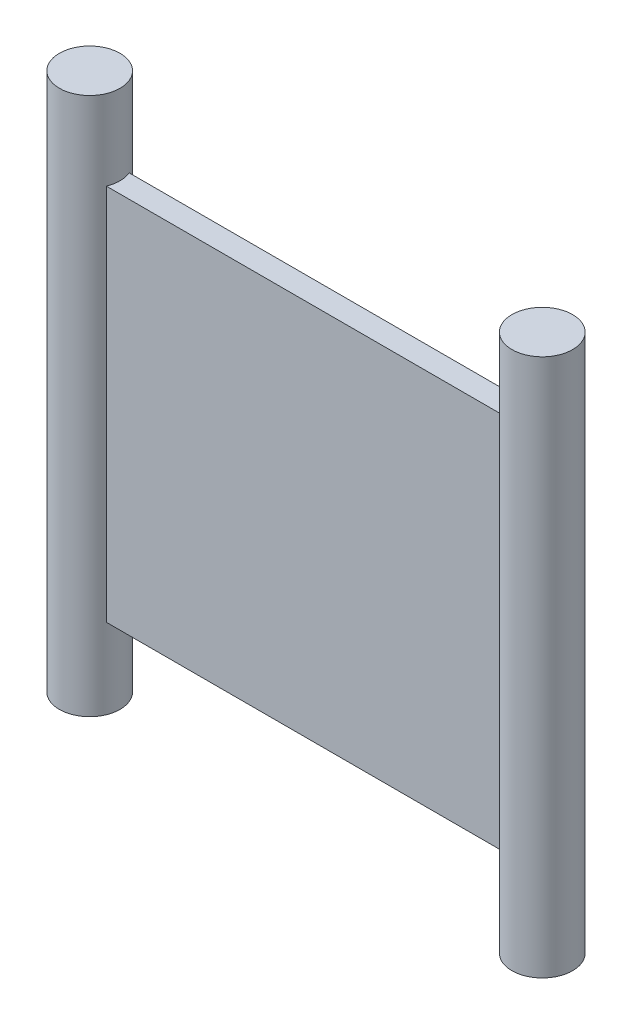
ISO-10303-21;
HEADER;
FILE_DESCRIPTION(('STEP AP214'),'2;1');
FILE_NAME('part.step','',(''),(''),'','','');
FILE_SCHEMA(('AUTOMOTIVE_DESIGN { 1 0 10303 214 1 1 1 1 }'));
ENDSEC;
DATA;
#1=APPLICATION_CONTEXT('core data for automotive mechanical design processes');
#2=APPLICATION_PROTOCOL_DEFINITION('international standard','automotive_design',2000,#1);
#3=PRODUCT_CONTEXT('',#1,'mechanical');
#4=PRODUCT('Part','Part','',(#3));
#5=PRODUCT_RELATED_PRODUCT_CATEGORY('part','',(#4));
#6=PRODUCT_DEFINITION_FORMATION('','',#4);
#7=PRODUCT_DEFINITION_CONTEXT('part definition',#1,'design');
#8=PRODUCT_DEFINITION('design','',#6,#7);
#9=PRODUCT_DEFINITION_SHAPE('','',#8);
#10=(LENGTH_UNIT() NAMED_UNIT(*) SI_UNIT(.MILLI.,.METRE.));
#11=(NAMED_UNIT(*) PLANE_ANGLE_UNIT() SI_UNIT($,.RADIAN.));
#12=(NAMED_UNIT(*) SI_UNIT($,.STERADIAN.) SOLID_ANGLE_UNIT());
#13=UNCERTAINTY_MEASURE_WITH_UNIT(LENGTH_MEASURE(1.E-05),#10,'distance_accuracy_value','');
#14=(GEOMETRIC_REPRESENTATION_CONTEXT(3) GLOBAL_UNCERTAINTY_ASSIGNED_CONTEXT((#13)) GLOBAL_UNIT_ASSIGNED_CONTEXT((#10,
#11,#12)) REPRESENTATION_CONTEXT('',''));
#15=CARTESIAN_POINT('',(0.,0.,0.));
#16=DIRECTION('',(0.,0.,1.));
#17=DIRECTION('',(1.,0.,0.));
#18=AXIS2_PLACEMENT_3D('',#15,#16,#17);
#19=CARTESIAN_POINT('',(9.885,16.5,0.499999999999999));
#20=DIRECTION('',(0.,0.,-1.));
#21=DIRECTION('',(-1.,0.,0.));
#22=AXIS2_PLACEMENT_3D('',#19,#20,#21);
#23=PLANE('',#22);
#24=DIRECTION('',(0.,-1.,0.));
#25=VECTOR('',#24,1.);
#26=CARTESIAN_POINT('',(8.6579608808192,20.,0.499999999999999));
#27=LINE('',#26,#25);
#28=CARTESIAN_POINT('',(8.6579608808192,16.5,0.499999999999999));
#29=VERTEX_POINT('',#28);
#30=CARTESIAN_POINT('',(8.6579608808192,0.,0.499999999999999));
#31=VERTEX_POINT('',#30);
#32=EDGE_CURVE('E53',#29,#31,#27,.T.);
#33=ORIENTED_EDGE('',*,*,#32,.F.);
#34=DIRECTION('',(1.,0.,0.));
#35=VECTOR('',#34,1.);
#36=CARTESIAN_POINT('',(9.885,16.5,0.499999999999999));
#37=LINE('',#36,#35);
#38=CARTESIAN_POINT('',(-8.65796088081919,16.5,0.500000000000001));
#39=VERTEX_POINT('',#38);
#40=EDGE_CURVE('E90',#39,#29,#37,.T.);
#41=ORIENTED_EDGE('',*,*,#40,.F.);
#42=DIRECTION('',(0.,-1.,0.));
#43=VECTOR('',#42,1.);
#44=CARTESIAN_POINT('',(-8.65796088081919,20.,0.500000000000001));
#45=LINE('',#44,#43);
#46=CARTESIAN_POINT('',(-8.65796088081919,0.,0.500000000000001));
#47=VERTEX_POINT('',#46);
#48=EDGE_CURVE('E103',#47,#39,#45,.F.);
#49=ORIENTED_EDGE('',*,*,#48,.F.);
#50=DIRECTION('',(1.,0.,0.));
#51=VECTOR('',#50,1.);
#52=CARTESIAN_POINT('',(9.885,0.,0.499999999999999));
#53=LINE('',#52,#51);
#54=EDGE_CURVE('E91',#47,#31,#53,.T.);
#55=ORIENTED_EDGE('',*,*,#54,.T.);
#56=EDGE_LOOP('',(#33,#41,#49,#55));
#57=FACE_BOUND('',#56,.T.);
#58=ADVANCED_FACE('F39',(#57),#23,.F.);
#59=CARTESIAN_POINT('',(9.885,16.5,-0.500000000000001));
#60=DIRECTION('',(0.,0.,1.));
#61=DIRECTION('',(1.,0.,0.));
#62=AXIS2_PLACEMENT_3D('',#59,#60,#61);
#63=PLANE('',#62);
#64=DIRECTION('',(0.,-1.,0.));
#65=VECTOR('',#64,1.);
#66=CARTESIAN_POINT('',(8.6579608808192,20.,-0.500000000000001));
#67=LINE('',#66,#65);
#68=CARTESIAN_POINT('',(8.6579608808192,0.,-0.500000000000001));
#69=VERTEX_POINT('',#68);
#70=CARTESIAN_POINT('',(8.6579608808192,16.5,-0.500000000000001));
#71=VERTEX_POINT('',#70);
#72=EDGE_CURVE('E78',#69,#71,#67,.F.);
#73=ORIENTED_EDGE('',*,*,#72,.F.);
#74=DIRECTION('',(-1.,0.,0.));
#75=VECTOR('',#74,1.);
#76=CARTESIAN_POINT('',(9.885,0.,-0.500000000000001));
#77=LINE('',#76,#75);
#78=CARTESIAN_POINT('',(-8.65796088081919,0.,-0.499999999999999));
#79=VERTEX_POINT('',#78);
#80=EDGE_CURVE('E60',#69,#79,#77,.T.);
#81=ORIENTED_EDGE('',*,*,#80,.T.);
#82=DIRECTION('',(0.,-1.,0.));
#83=VECTOR('',#82,1.);
#84=CARTESIAN_POINT('',(-8.65796088081919,20.,-0.499999999999999));
#85=LINE('',#84,#83);
#86=CARTESIAN_POINT('',(-8.65796088081919,16.5,-0.499999999999999));
#87=VERTEX_POINT('',#86);
#88=EDGE_CURVE('E105',#87,#79,#85,.T.);
#89=ORIENTED_EDGE('',*,*,#88,.F.);
#90=DIRECTION('',(-1.,0.,0.));
#91=VECTOR('',#90,1.);
#92=CARTESIAN_POINT('',(9.885,16.5,-0.500000000000001));
#93=LINE('',#92,#91);
#94=EDGE_CURVE('E85',#71,#87,#93,.T.);
#95=ORIENTED_EDGE('',*,*,#94,.F.);
#96=EDGE_LOOP('',(#73,#81,#89,#95));
#97=FACE_BOUND('',#96,.T.);
#98=ADVANCED_FACE('F84',(#97),#63,.F.);
#99=CARTESIAN_POINT('',(-9.885,20.,0.));
#100=DIRECTION('',(0.,-1.,0.));
#101=DIRECTION('',(0.,0.,-1.));
#102=AXIS2_PLACEMENT_3D('',#99,#100,#101);
#103=CYLINDRICAL_SURFACE('',#102,1.325);
#104=CARTESIAN_POINT('',(-9.885,20.,0.));
#105=DIRECTION('',(0.,1.,0.));
#106=DIRECTION('',(0.,0.,1.));
#107=AXIS2_PLACEMENT_3D('',#104,#105,#106);
#108=CIRCLE('',#107,1.325);
#109=CARTESIAN_POINT('',(-9.885,20.,1.325));
#110=VERTEX_POINT('',#109);
#111=EDGE_CURVE('E107',#110,#110,#108,.T.);
#112=ORIENTED_EDGE('',*,*,#111,.F.);
#113=EDGE_LOOP('',(#112));
#114=FACE_BOUND('',#113,.T.);
#115=CARTESIAN_POINT('',(-9.885,-3.5,0.));
#116=DIRECTION('',(0.,1.,0.));
#117=DIRECTION('',(0.,0.,1.));
#118=AXIS2_PLACEMENT_3D('',#115,#116,#117);
#119=CIRCLE('',#118,1.325);
#120=CARTESIAN_POINT('',(-9.885,-3.5,1.325));
#121=VERTEX_POINT('',#120);
#122=EDGE_CURVE('E108',#121,#121,#119,.T.);
#123=ORIENTED_EDGE('',*,*,#122,.T.);
#124=EDGE_LOOP('',(#123));
#125=FACE_BOUND('',#124,.T.);
#126=ORIENTED_EDGE('',*,*,#48,.T.);
#127=CARTESIAN_POINT('',(-9.885,16.5,0.));
#128=DIRECTION('',(0.,-1.,0.));
#129=DIRECTION('',(0.,0.,-1.));
#130=AXIS2_PLACEMENT_3D('',#127,#128,#129);
#131=CIRCLE('',#130,1.325);
#132=EDGE_CURVE('E95',#39,#87,#131,.F.);
#133=ORIENTED_EDGE('',*,*,#132,.T.);
#134=ORIENTED_EDGE('',*,*,#88,.T.);
#135=CARTESIAN_POINT('',(-9.885,0.,0.));
#136=DIRECTION('',(0.,-1.,0.));
#137=DIRECTION('',(0.,0.,-1.));
#138=AXIS2_PLACEMENT_3D('',#135,#136,#137);
#139=CIRCLE('',#138,1.325);
#140=EDGE_CURVE('E46',#47,#79,#139,.F.);
#141=ORIENTED_EDGE('',*,*,#140,.F.);
#142=EDGE_LOOP('',(#126,#133,#134,#141));
#143=FACE_BOUND('',#142,.T.);
#144=ADVANCED_FACE('F138',(#114,#125,#143),#103,.T.);
#145=CARTESIAN_POINT('',(-9.885,20.,0.));
#146=DIRECTION('',(0.,1.,0.));
#147=DIRECTION('',(0.,0.,1.));
#148=AXIS2_PLACEMENT_3D('',#145,#146,#147);
#149=PLANE('',#148);
#150=ORIENTED_EDGE('',*,*,#111,.T.);
#151=EDGE_LOOP('',(#150));
#152=FACE_BOUND('',#151,.T.);
#153=ADVANCED_FACE('F144',(#152),#149,.T.);
#154=CARTESIAN_POINT('',(-9.885,-3.5,0.));
#155=DIRECTION('',(0.,1.,0.));
#156=DIRECTION('',(0.,0.,1.));
#157=AXIS2_PLACEMENT_3D('',#154,#155,#156);
#158=PLANE('',#157);
#159=ORIENTED_EDGE('',*,*,#122,.F.);
#160=EDGE_LOOP('',(#159));
#161=FACE_BOUND('',#160,.T.);
#162=ADVANCED_FACE('F150',(#161),#158,.F.);
#163=CARTESIAN_POINT('',(0.,16.5,0.));
#164=DIRECTION('',(0.,-1.,0.));
#165=DIRECTION('',(0.,0.,-1.));
#166=AXIS2_PLACEMENT_3D('',#163,#164,#165);
#167=PLANE('',#166);
#168=CARTESIAN_POINT('',(9.885,16.5,0.));
#169=DIRECTION('',(0.,-1.,0.));
#170=DIRECTION('',(0.,0.,-1.));
#171=AXIS2_PLACEMENT_3D('',#168,#169,#170);
#172=CIRCLE('',#171,1.325);
#173=EDGE_CURVE('E111',#71,#29,#172,.F.);
#174=ORIENTED_EDGE('',*,*,#173,.F.);
#175=ORIENTED_EDGE('',*,*,#94,.T.);
#176=ORIENTED_EDGE('',*,*,#132,.F.);
#177=ORIENTED_EDGE('',*,*,#40,.T.);
#178=EDGE_LOOP('',(#174,#175,#176,#177));
#179=FACE_BOUND('',#178,.T.);
#180=ADVANCED_FACE('F141',(#179),#167,.F.);
#181=CARTESIAN_POINT('',(0.,0.,0.));
#182=DIRECTION('',(0.,-1.,0.));
#183=DIRECTION('',(0.,0.,-1.));
#184=AXIS2_PLACEMENT_3D('',#181,#182,#183);
#185=PLANE('',#184);
#186=ORIENTED_EDGE('',*,*,#80,.F.);
#187=CARTESIAN_POINT('',(9.885,0.,0.));
#188=DIRECTION('',(0.,-1.,0.));
#189=DIRECTION('',(0.,0.,-1.));
#190=AXIS2_PLACEMENT_3D('',#187,#188,#189);
#191=CIRCLE('',#190,1.325);
#192=EDGE_CURVE('E11',#69,#31,#191,.F.);
#193=ORIENTED_EDGE('',*,*,#192,.T.);
#194=ORIENTED_EDGE('',*,*,#54,.F.);
#195=ORIENTED_EDGE('',*,*,#140,.T.);
#196=EDGE_LOOP('',(#186,#193,#194,#195));
#197=FACE_BOUND('',#196,.T.);
#198=ADVANCED_FACE('F89',(#197),#185,.T.);
#199=CARTESIAN_POINT('',(9.885,20.,0.));
#200=DIRECTION('',(0.,-1.,0.));
#201=DIRECTION('',(0.,0.,-1.));
#202=AXIS2_PLACEMENT_3D('',#199,#200,#201);
#203=CYLINDRICAL_SURFACE('',#202,1.325);
#204=CARTESIAN_POINT('',(9.885,20.,0.));
#205=DIRECTION('',(0.,1.,0.));
#206=DIRECTION('',(0.,0.,1.));
#207=AXIS2_PLACEMENT_3D('',#204,#205,#206);
#208=CIRCLE('',#207,1.325);
#209=CARTESIAN_POINT('',(9.885,20.,1.325));
#210=VERTEX_POINT('',#209);
#211=EDGE_CURVE('E116',#210,#210,#208,.T.);
#212=ORIENTED_EDGE('',*,*,#211,.F.);
#213=EDGE_LOOP('',(#212));
#214=FACE_BOUND('',#213,.T.);
#215=CARTESIAN_POINT('',(9.885,-3.5,0.));
#216=DIRECTION('',(0.,1.,0.));
#217=DIRECTION('',(0.,0.,1.));
#218=AXIS2_PLACEMENT_3D('',#215,#216,#217);
#219=CIRCLE('',#218,1.325);
#220=CARTESIAN_POINT('',(9.885,-3.5,1.325));
#221=VERTEX_POINT('',#220);
#222=EDGE_CURVE('E86',#221,#221,#219,.T.);
#223=ORIENTED_EDGE('',*,*,#222,.T.);
#224=EDGE_LOOP('',(#223));
#225=FACE_BOUND('',#224,.T.);
#226=ORIENTED_EDGE('',*,*,#72,.T.);
#227=ORIENTED_EDGE('',*,*,#173,.T.);
#228=ORIENTED_EDGE('',*,*,#32,.T.);
#229=ORIENTED_EDGE('',*,*,#192,.F.);
#230=EDGE_LOOP('',(#226,#227,#228,#229));
#231=FACE_BOUND('',#230,.T.);
#232=ADVANCED_FACE('F77',(#214,#225,#231),#203,.T.);
#233=CARTESIAN_POINT('',(9.885,20.,0.));
#234=DIRECTION('',(0.,1.,0.));
#235=DIRECTION('',(0.,0.,1.));
#236=AXIS2_PLACEMENT_3D('',#233,#234,#235);
#237=PLANE('',#236);
#238=ORIENTED_EDGE('',*,*,#211,.T.);
#239=EDGE_LOOP('',(#238));
#240=FACE_BOUND('',#239,.T.);
#241=ADVANCED_FACE('F125',(#240),#237,.T.);
#242=CARTESIAN_POINT('',(9.885,-3.5,0.));
#243=DIRECTION('',(0.,1.,0.));
#244=DIRECTION('',(0.,0.,1.));
#245=AXIS2_PLACEMENT_3D('',#242,#243,#244);
#246=PLANE('',#245);
#247=ORIENTED_EDGE('',*,*,#222,.F.);
#248=EDGE_LOOP('',(#247));
#249=FACE_BOUND('',#248,.T.);
#250=ADVANCED_FACE('F123',(#249),#246,.F.);
#251=CLOSED_SHELL('',(#58,#98,#144,#153,#162,#180,#198,#232,#241,#250));
#252=MANIFOLD_SOLID_BREP('B2',#251);
#253=ADVANCED_BREP_SHAPE_REPRESENTATION('',(#18,#252),#14);
#254=SHAPE_DEFINITION_REPRESENTATION(#9,#253);
ENDSEC;
END-ISO-10303-21;
